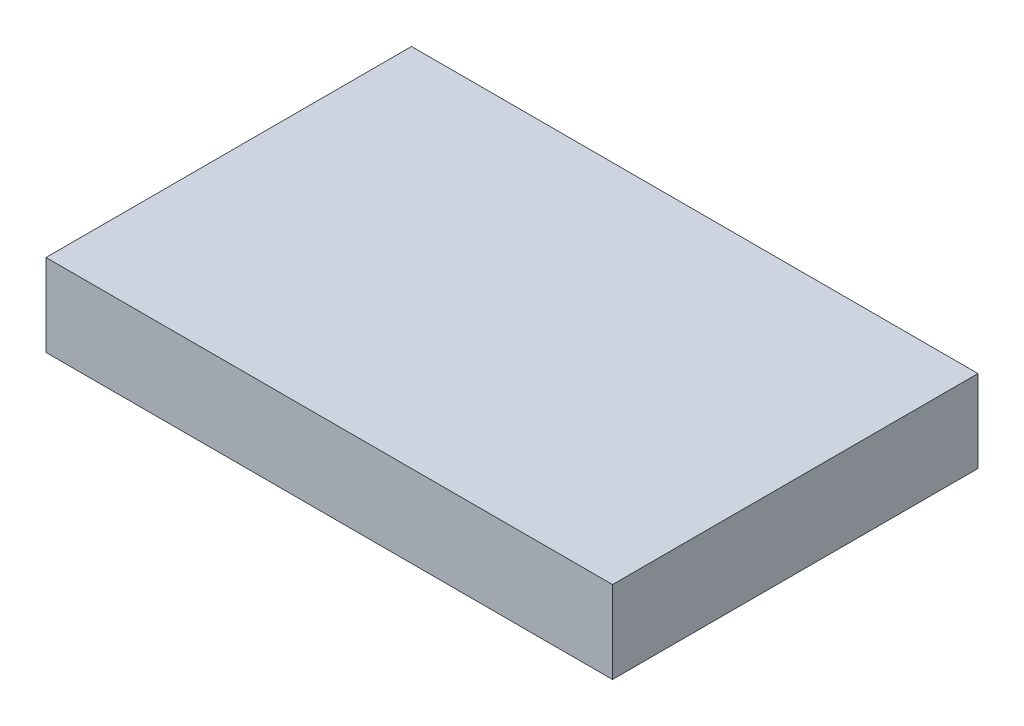
ISO-10303-21;
HEADER;
FILE_DESCRIPTION(('STEP AP214'),'2;1');
FILE_NAME('part.step','',(''),(''),'','','');
FILE_SCHEMA(('AUTOMOTIVE_DESIGN { 1 0 10303 214 1 1 1 1 }'));
ENDSEC;
DATA;
#1=APPLICATION_CONTEXT('core data for automotive mechanical design processes');
#2=APPLICATION_PROTOCOL_DEFINITION('international standard','automotive_design',2000,#1);
#3=PRODUCT_CONTEXT('',#1,'mechanical');
#4=PRODUCT('Part','Part','',(#3));
#5=PRODUCT_RELATED_PRODUCT_CATEGORY('part','',(#4));
#6=PRODUCT_DEFINITION_FORMATION('','',#4);
#7=PRODUCT_DEFINITION_CONTEXT('part definition',#1,'design');
#8=PRODUCT_DEFINITION('design','',#6,#7);
#9=PRODUCT_DEFINITION_SHAPE('','',#8);
#10=(LENGTH_UNIT() NAMED_UNIT(*) SI_UNIT(.MILLI.,.METRE.));
#11=(NAMED_UNIT(*) PLANE_ANGLE_UNIT() SI_UNIT($,.RADIAN.));
#12=(NAMED_UNIT(*) SI_UNIT($,.STERADIAN.) SOLID_ANGLE_UNIT());
#13=UNCERTAINTY_MEASURE_WITH_UNIT(LENGTH_MEASURE(1.E-05),#10,'distance_accuracy_value','');
#14=(GEOMETRIC_REPRESENTATION_CONTEXT(3) GLOBAL_UNCERTAINTY_ASSIGNED_CONTEXT((#13)) GLOBAL_UNIT_ASSIGNED_CONTEXT((#10,
#11,#12)) REPRESENTATION_CONTEXT('',''));
#15=CARTESIAN_POINT('',(0.,0.,0.));
#16=DIRECTION('',(0.,0.,1.));
#17=DIRECTION('',(1.,0.,0.));
#18=AXIS2_PLACEMENT_3D('',#15,#16,#17);
#19=CARTESIAN_POINT('',(-62.,18.,40.));
#20=DIRECTION('',(1.,0.,0.));
#21=DIRECTION('',(0.,0.,-1.));
#22=AXIS2_PLACEMENT_3D('',#19,#20,#21);
#23=PLANE('',#22);
#24=DIRECTION('',(0.,0.,1.));
#25=VECTOR('',#24,1.);
#26=CARTESIAN_POINT('',(-62.,0.,40.));
#27=LINE('',#26,#25);
#28=CARTESIAN_POINT('',(-62.,0.,-40.));
#29=VERTEX_POINT('',#28);
#30=CARTESIAN_POINT('',(-62.,0.,40.));
#31=VERTEX_POINT('',#30);
#32=EDGE_CURVE('E95',#29,#31,#27,.T.);
#33=ORIENTED_EDGE('',*,*,#32,.T.);
#34=DIRECTION('',(0.,-1.,0.));
#35=VECTOR('',#34,1.);
#36=CARTESIAN_POINT('',(-62.,18.,40.));
#37=LINE('',#36,#35);
#38=CARTESIAN_POINT('',(-62.,18.,40.));
#39=VERTEX_POINT('',#38);
#40=EDGE_CURVE('E11',#39,#31,#37,.T.);
#41=ORIENTED_EDGE('',*,*,#40,.F.);
#42=DIRECTION('',(0.,0.,1.));
#43=VECTOR('',#42,1.);
#44=CARTESIAN_POINT('',(-62.,18.,40.));
#45=LINE('',#44,#43);
#46=CARTESIAN_POINT('',(-62.,18.,-40.));
#47=VERTEX_POINT('',#46);
#48=EDGE_CURVE('E83',#47,#39,#45,.T.);
#49=ORIENTED_EDGE('',*,*,#48,.F.);
#50=DIRECTION('',(0.,-1.,0.));
#51=VECTOR('',#50,1.);
#52=CARTESIAN_POINT('',(-62.,18.,-40.));
#53=LINE('',#52,#51);
#54=EDGE_CURVE('E91',#47,#29,#53,.T.);
#55=ORIENTED_EDGE('',*,*,#54,.T.);
#56=EDGE_LOOP('',(#33,#41,#49,#55));
#57=FACE_BOUND('',#56,.T.);
#58=ADVANCED_FACE('F32',(#57),#23,.F.);
#59=CARTESIAN_POINT('',(62.,18.,40.));
#60=DIRECTION('',(0.,0.,-1.));
#61=DIRECTION('',(-1.,0.,0.));
#62=AXIS2_PLACEMENT_3D('',#59,#60,#61);
#63=PLANE('',#62);
#64=DIRECTION('',(1.,0.,0.));
#65=VECTOR('',#64,1.);
#66=CARTESIAN_POINT('',(62.,0.,40.));
#67=LINE('',#66,#65);
#68=CARTESIAN_POINT('',(62.,0.,40.));
#69=VERTEX_POINT('',#68);
#70=EDGE_CURVE('E87',#31,#69,#67,.T.);
#71=ORIENTED_EDGE('',*,*,#70,.T.);
#72=DIRECTION('',(0.,-1.,0.));
#73=VECTOR('',#72,1.);
#74=CARTESIAN_POINT('',(62.,18.,40.));
#75=LINE('',#74,#73);
#76=CARTESIAN_POINT('',(62.,18.,40.));
#77=VERTEX_POINT('',#76);
#78=EDGE_CURVE('E40',#77,#69,#75,.T.);
#79=ORIENTED_EDGE('',*,*,#78,.F.);
#80=DIRECTION('',(1.,0.,0.));
#81=VECTOR('',#80,1.);
#82=CARTESIAN_POINT('',(62.,18.,40.));
#83=LINE('',#82,#81);
#84=EDGE_CURVE('E78',#39,#77,#83,.T.);
#85=ORIENTED_EDGE('',*,*,#84,.F.);
#86=ORIENTED_EDGE('',*,*,#40,.T.);
#87=EDGE_LOOP('',(#71,#79,#85,#86));
#88=FACE_BOUND('',#87,.T.);
#89=ADVANCED_FACE('F86',(#88),#63,.F.);
#90=CARTESIAN_POINT('',(62.,18.,40.));
#91=DIRECTION('',(-1.,0.,0.));
#92=DIRECTION('',(0.,0.,1.));
#93=AXIS2_PLACEMENT_3D('',#90,#91,#92);
#94=PLANE('',#93);
#95=DIRECTION('',(0.,0.,-1.));
#96=VECTOR('',#95,1.);
#97=CARTESIAN_POINT('',(62.,0.,40.));
#98=LINE('',#97,#96);
#99=CARTESIAN_POINT('',(62.,0.,-40.));
#100=VERTEX_POINT('',#99);
#101=EDGE_CURVE('E65',#69,#100,#98,.T.);
#102=ORIENTED_EDGE('',*,*,#101,.T.);
#103=DIRECTION('',(0.,-1.,0.));
#104=VECTOR('',#103,1.);
#105=CARTESIAN_POINT('',(62.,18.,-40.));
#106=LINE('',#105,#104);
#107=CARTESIAN_POINT('',(62.,18.,-40.));
#108=VERTEX_POINT('',#107);
#109=EDGE_CURVE('E88',#108,#100,#106,.T.);
#110=ORIENTED_EDGE('',*,*,#109,.F.);
#111=DIRECTION('',(0.,0.,-1.));
#112=VECTOR('',#111,1.);
#113=CARTESIAN_POINT('',(62.,18.,40.));
#114=LINE('',#113,#112);
#115=EDGE_CURVE('E81',#77,#108,#114,.T.);
#116=ORIENTED_EDGE('',*,*,#115,.F.);
#117=ORIENTED_EDGE('',*,*,#78,.T.);
#118=EDGE_LOOP('',(#102,#110,#116,#117));
#119=FACE_BOUND('',#118,.T.);
#120=ADVANCED_FACE('F89',(#119),#94,.F.);
#121=CARTESIAN_POINT('',(62.,18.,-40.));
#122=DIRECTION('',(0.,0.,1.));
#123=DIRECTION('',(1.,0.,0.));
#124=AXIS2_PLACEMENT_3D('',#121,#122,#123);
#125=PLANE('',#124);
#126=DIRECTION('',(-1.,0.,0.));
#127=VECTOR('',#126,1.);
#128=CARTESIAN_POINT('',(62.,0.,-40.));
#129=LINE('',#128,#127);
#130=EDGE_CURVE('E71',#100,#29,#129,.T.);
#131=ORIENTED_EDGE('',*,*,#130,.T.);
#132=ORIENTED_EDGE('',*,*,#54,.F.);
#133=DIRECTION('',(-1.,0.,0.));
#134=VECTOR('',#133,1.);
#135=CARTESIAN_POINT('',(62.,18.,-40.));
#136=LINE('',#135,#134);
#137=EDGE_CURVE('E48',#108,#47,#136,.T.);
#138=ORIENTED_EDGE('',*,*,#137,.F.);
#139=ORIENTED_EDGE('',*,*,#109,.T.);
#140=EDGE_LOOP('',(#131,#132,#138,#139));
#141=FACE_BOUND('',#140,.T.);
#142=ADVANCED_FACE('F102',(#141),#125,.F.);
#143=CARTESIAN_POINT('',(0.,18.,0.));
#144=DIRECTION('',(0.,1.,0.));
#145=DIRECTION('',(0.,0.,1.));
#146=AXIS2_PLACEMENT_3D('',#143,#144,#145);
#147=PLANE('',#146);
#148=ORIENTED_EDGE('',*,*,#48,.T.);
#149=ORIENTED_EDGE('',*,*,#84,.T.);
#150=ORIENTED_EDGE('',*,*,#115,.T.);
#151=ORIENTED_EDGE('',*,*,#137,.T.);
#152=EDGE_LOOP('',(#148,#149,#150,#151));
#153=FACE_BOUND('',#152,.T.);
#154=ADVANCED_FACE('F79',(#153),#147,.T.);
#155=CARTESIAN_POINT('',(0.,0.,0.));
#156=DIRECTION('',(0.,1.,0.));
#157=DIRECTION('',(0.,0.,1.));
#158=AXIS2_PLACEMENT_3D('',#155,#156,#157);
#159=PLANE('',#158);
#160=ORIENTED_EDGE('',*,*,#32,.F.);
#161=ORIENTED_EDGE('',*,*,#130,.F.);
#162=ORIENTED_EDGE('',*,*,#101,.F.);
#163=ORIENTED_EDGE('',*,*,#70,.F.);
#164=EDGE_LOOP('',(#160,#161,#162,#163));
#165=FACE_BOUND('',#164,.T.);
#166=ADVANCED_FACE('F105',(#165),#159,.F.);
#167=CLOSED_SHELL('',(#58,#89,#120,#142,#154,#166));
#168=MANIFOLD_SOLID_BREP('B2',#167);
#169=ADVANCED_BREP_SHAPE_REPRESENTATION('',(#18,#168),#14);
#170=SHAPE_DEFINITION_REPRESENTATION(#9,#169);
ENDSEC;
END-ISO-10303-21;
